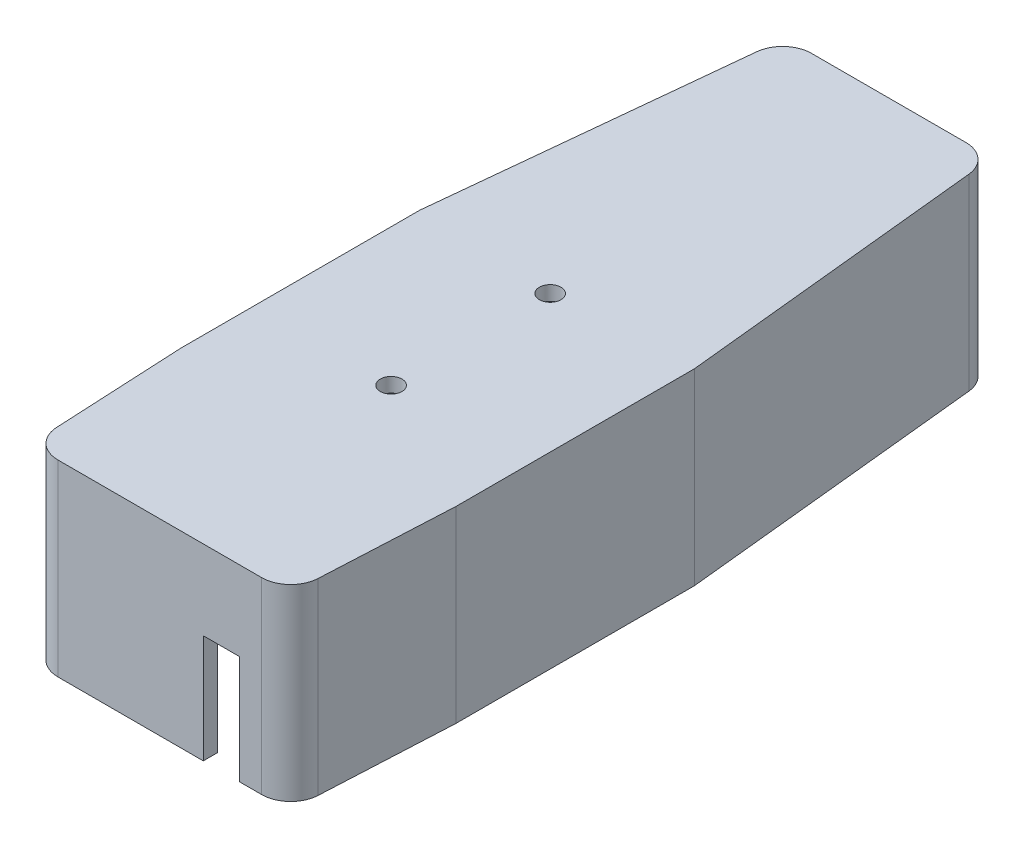
ISO-10303-21;
HEADER;
FILE_DESCRIPTION(('STEP AP214'),'2;1');
FILE_NAME('part.step','',(''),(''),'','','');
FILE_SCHEMA(('AUTOMOTIVE_DESIGN { 1 0 10303 214 1 1 1 1 }'));
ENDSEC;
DATA;
#1=APPLICATION_CONTEXT('core data for automotive mechanical design processes');
#2=APPLICATION_PROTOCOL_DEFINITION('international standard','automotive_design',2000,#1);
#3=PRODUCT_CONTEXT('',#1,'mechanical');
#4=PRODUCT('Part','Part','',(#3));
#5=PRODUCT_RELATED_PRODUCT_CATEGORY('part','',(#4));
#6=PRODUCT_DEFINITION_FORMATION('','',#4);
#7=PRODUCT_DEFINITION_CONTEXT('part definition',#1,'design');
#8=PRODUCT_DEFINITION('design','',#6,#7);
#9=PRODUCT_DEFINITION_SHAPE('','',#8);
#10=(LENGTH_UNIT() NAMED_UNIT(*) SI_UNIT(.MILLI.,.METRE.));
#11=(NAMED_UNIT(*) PLANE_ANGLE_UNIT() SI_UNIT($,.RADIAN.));
#12=(NAMED_UNIT(*) SI_UNIT($,.STERADIAN.) SOLID_ANGLE_UNIT());
#13=UNCERTAINTY_MEASURE_WITH_UNIT(LENGTH_MEASURE(1.E-05),#10,'distance_accuracy_value','');
#14=(GEOMETRIC_REPRESENTATION_CONTEXT(3) GLOBAL_UNCERTAINTY_ASSIGNED_CONTEXT((#13)) GLOBAL_UNIT_ASSIGNED_CONTEXT((#10,
#11,#12)) REPRESENTATION_CONTEXT('',''));
#15=CARTESIAN_POINT('',(0.,0.,0.));
#16=DIRECTION('',(0.,0.,1.));
#17=DIRECTION('',(1.,0.,0.));
#18=AXIS2_PLACEMENT_3D('',#15,#16,#17);
#19=CARTESIAN_POINT('',(6.3058870469266,26.,-74.8480245299378));
#20=DIRECTION('',(0.,-1.,0.));
#21=DIRECTION('',(0.,0.,-1.));
#22=AXIS2_PLACEMENT_3D('',#19,#20,#21);
#23=CYLINDRICAL_SURFACE('',#22,2.);
#24=DIRECTION('',(0.,1.,0.));
#25=VECTOR('',#24,1.);
#26=CARTESIAN_POINT('',(4.31626541224294,26.,-75.0515085607578));
#27=LINE('',#26,#25);
#28=CARTESIAN_POINT('',(4.31626541224294,24.,-75.0515085607578));
#29=VERTEX_POINT('',#28);
#30=CARTESIAN_POINT('',(4.31626541224294,3.,-75.0515085607578));
#31=VERTEX_POINT('',#30);
#32=EDGE_CURVE('E251',#29,#31,#27,.F.);
#33=ORIENTED_EDGE('',*,*,#32,.T.);
#34=CARTESIAN_POINT('',(6.3058870469266,3.,-74.8480245299378));
#35=DIRECTION('',(0.,-1.,0.));
#36=DIRECTION('',(0.,0.,-1.));
#37=AXIS2_PLACEMENT_3D('',#34,#35,#36);
#38=CIRCLE('',#37,2.);
#39=CARTESIAN_POINT('',(6.30588704692662,3.,-76.8480245299378));
#40=VERTEX_POINT('',#39);
#41=EDGE_CURVE('E235',#31,#40,#38,.T.);
#42=ORIENTED_EDGE('',*,*,#41,.T.);
#43=DIRECTION('',(0.,-1.,0.));
#44=VECTOR('',#43,1.);
#45=CARTESIAN_POINT('',(6.30588704692661,26.,-76.8480245299378));
#46=LINE('',#45,#44);
#47=CARTESIAN_POINT('',(6.30588704692661,24.,-76.8480245299378));
#48=VERTEX_POINT('',#47);
#49=EDGE_CURVE('E248',#48,#40,#46,.T.);
#50=ORIENTED_EDGE('',*,*,#49,.F.);
#51=CARTESIAN_POINT('',(6.3058870469266,24.,-74.8480245299378));
#52=DIRECTION('',(0.,-1.,0.));
#53=DIRECTION('',(0.,0.,-1.));
#54=AXIS2_PLACEMENT_3D('',#51,#52,#53);
#55=CIRCLE('',#54,2.);
#56=EDGE_CURVE('E265',#48,#29,#55,.F.);
#57=ORIENTED_EDGE('',*,*,#56,.T.);
#58=EDGE_LOOP('',(#33,#42,#50,#57));
#59=FACE_BOUND('',#58,.T.);
#60=ADVANCED_FACE('F32',(#59),#23,.F.);
#61=CARTESIAN_POINT('',(27.6941129530734,26.,-74.8480245299378));
#62=DIRECTION('',(0.,-1.,0.));
#63=DIRECTION('',(0.,0.,-1.));
#64=AXIS2_PLACEMENT_3D('',#61,#62,#63);
#65=CYLINDRICAL_SURFACE('',#64,2.);
#66=DIRECTION('',(0.,1.,0.));
#67=VECTOR('',#66,1.);
#68=CARTESIAN_POINT('',(27.6941129530734,26.,-76.8480245299378));
#69=LINE('',#68,#67);
#70=CARTESIAN_POINT('',(27.6941129530734,24.,-76.8480245299378));
#71=VERTEX_POINT('',#70);
#72=CARTESIAN_POINT('',(27.6941129530734,3.,-76.8480245299378));
#73=VERTEX_POINT('',#72);
#74=EDGE_CURVE('E257',#71,#73,#69,.F.);
#75=ORIENTED_EDGE('',*,*,#74,.T.);
#76=CARTESIAN_POINT('',(27.6941129530734,3.,-74.8480245299378));
#77=DIRECTION('',(0.,-1.,0.));
#78=DIRECTION('',(0.,0.,-1.));
#79=AXIS2_PLACEMENT_3D('',#76,#77,#78);
#80=CIRCLE('',#79,2.);
#81=CARTESIAN_POINT('',(29.6837345877571,3.,-75.0515085607577));
#82=VERTEX_POINT('',#81);
#83=EDGE_CURVE('E238',#73,#82,#80,.T.);
#84=ORIENTED_EDGE('',*,*,#83,.T.);
#85=DIRECTION('',(0.,-1.,0.));
#86=VECTOR('',#85,1.);
#87=CARTESIAN_POINT('',(29.6837345877571,26.,-75.0515085607577));
#88=LINE('',#87,#86);
#89=CARTESIAN_POINT('',(29.6837345877571,24.,-75.0515085607577));
#90=VERTEX_POINT('',#89);
#91=EDGE_CURVE('E259',#90,#82,#88,.T.);
#92=ORIENTED_EDGE('',*,*,#91,.F.);
#93=CARTESIAN_POINT('',(27.6941129530734,24.,-74.8480245299378));
#94=DIRECTION('',(0.,-1.,0.));
#95=DIRECTION('',(0.,0.,-1.));
#96=AXIS2_PLACEMENT_3D('',#93,#94,#95);
#97=CIRCLE('',#96,2.);
#98=EDGE_CURVE('E261',#90,#71,#97,.F.);
#99=ORIENTED_EDGE('',*,*,#98,.T.);
#100=EDGE_LOOP('',(#75,#84,#92,#99));
#101=FACE_BOUND('',#100,.T.);
#102=ADVANCED_FACE('F530',(#101),#65,.F.);
#103=CARTESIAN_POINT('',(6.30588704692662,26.,-76.8480245299378));
#104=DIRECTION('',(0.,0.,1.));
#105=DIRECTION('',(1.,0.,0.));
#106=AXIS2_PLACEMENT_3D('',#103,#104,#105);
#107=PLANE('',#106);
#108=ORIENTED_EDGE('',*,*,#49,.T.);
#109=DIRECTION('',(1.,0.,0.));
#110=VECTOR('',#109,1.);
#111=CARTESIAN_POINT('',(27.6941129530734,3.,-76.8480245299378));
#112=LINE('',#111,#110);
#113=EDGE_CURVE('E231',#40,#73,#112,.T.);
#114=ORIENTED_EDGE('',*,*,#113,.T.);
#115=ORIENTED_EDGE('',*,*,#74,.F.);
#116=DIRECTION('',(-1.,0.,0.));
#117=VECTOR('',#116,1.);
#118=CARTESIAN_POINT('',(6.3058870469266,24.,-76.8480245299378));
#119=LINE('',#118,#117);
#120=EDGE_CURVE('E256',#71,#48,#119,.T.);
#121=ORIENTED_EDGE('',*,*,#120,.T.);
#122=EDGE_LOOP('',(#108,#114,#115,#121));
#123=FACE_BOUND('',#122,.T.);
#124=ADVANCED_FACE('F254',(#123),#107,.T.);
#125=CARTESIAN_POINT('',(6.3058870469266,0.,-74.8480245299378));
#126=DIRECTION('',(0.,-1.,0.));
#127=DIRECTION('',(0.,0.,-1.));
#128=AXIS2_PLACEMENT_3D('',#125,#126,#127);
#129=PLANE('',#128);
#130=CARTESIAN_POINT('',(9.33617507133186,0.,-71.8480245299378));
#131=DIRECTION('',(0.,-1.,0.));
#132=DIRECTION('',(0.,0.,-1.));
#133=AXIS2_PLACEMENT_3D('',#130,#131,#132);
#134=CIRCLE('',#133,1.397);
#135=CARTESIAN_POINT('',(9.33617507133186,0.,-73.2450245299378));
#136=VERTEX_POINT('',#135);
#137=EDGE_CURVE('E433',#136,#136,#134,.T.);
#138=ORIENTED_EDGE('',*,*,#137,.F.);
#139=EDGE_LOOP('',(#138));
#140=FACE_BOUND('',#139,.T.);
#141=CARTESIAN_POINT('',(24.3355116955853,0.,-71.8480245299378));
#142=DIRECTION('',(0.,-1.,0.));
#143=DIRECTION('',(0.,0.,-1.));
#144=AXIS2_PLACEMENT_3D('',#141,#142,#143);
#145=CIRCLE('',#144,1.397);
#146=CARTESIAN_POINT('',(24.3355116955853,0.,-73.2450245299378));
#147=VERTEX_POINT('',#146);
#148=EDGE_CURVE('E424',#147,#147,#145,.T.);
#149=ORIENTED_EDGE('',*,*,#148,.F.);
#150=EDGE_LOOP('',(#149));
#151=FACE_BOUND('',#150,.T.);
#152=DIRECTION('',(-1.,0.,0.));
#153=VECTOR('',#152,1.);
#154=CARTESIAN_POINT('',(30.5227272727273,0.,-66.8480245299378));
#155=LINE('',#154,#153);
#156=CARTESIAN_POINT('',(30.5227272727273,0.,-66.8480245299378));
#157=VERTEX_POINT('',#156);
#158=CARTESIAN_POINT('',(3.47727272727271,0.,-66.8480245299378));
#159=VERTEX_POINT('',#158);
#160=EDGE_CURVE('E252',#157,#159,#155,.T.);
#161=ORIENTED_EDGE('',*,*,#160,.T.);
#162=DIRECTION('',(-0.101742015409961,0.,0.99481081734183));
#163=VECTOR('',#162,1.);
#164=CARTESIAN_POINT('',(4.31626541224294,0.,-75.0515085607578));
#165=LINE('',#164,#163);
#166=CARTESIAN_POINT('',(0.,0.,-32.8480245299383));
#167=VERTEX_POINT('',#166);
#168=EDGE_CURVE('E57',#159,#167,#165,.T.);
#169=ORIENTED_EDGE('',*,*,#168,.T.);
#170=DIRECTION('',(0.,0.,1.));
#171=VECTOR('',#170,1.);
#172=CARTESIAN_POINT('',(0.,0.,-74.8480245299378));
#173=LINE('',#172,#171);
#174=CARTESIAN_POINT('',(0.,0.,0.));
#175=VERTEX_POINT('',#174);
#176=EDGE_CURVE('E328',#167,#175,#173,.T.);
#177=ORIENTED_EDGE('',*,*,#176,.T.);
#178=DIRECTION('',(0.0499376169438923,0.,0.998752338877845));
#179=VECTOR('',#178,1.);
#180=CARTESIAN_POINT('',(-3.71734315100207,0.,-74.3468630200414));
#181=LINE('',#180,#179);
#182=CARTESIAN_POINT('',(0.904993761694389,0.,18.0998752338878));
#183=VERTEX_POINT('',#182);
#184=EDGE_CURVE('E325',#175,#183,#181,.T.);
#185=ORIENTED_EDGE('',*,*,#184,.T.);
#186=CARTESIAN_POINT('',(2.90249843945008,0.,18.));
#187=DIRECTION('',(0.,-1.,0.));
#188=DIRECTION('',(0.,0.,-1.));
#189=AXIS2_PLACEMENT_3D('',#186,#187,#188);
#190=CIRCLE('',#189,2.);
#191=CARTESIAN_POINT('',(2.90249843945009,0.,20.));
#192=VERTEX_POINT('',#191);
#193=EDGE_CURVE('E322',#183,#192,#190,.F.);
#194=ORIENTED_EDGE('',*,*,#193,.T.);
#195=DIRECTION('',(1.,0.,0.));
#196=VECTOR('',#195,1.);
#197=CARTESIAN_POINT('',(6.30588704692659,0.,20.));
#198=LINE('',#197,#196);
#199=CARTESIAN_POINT('',(23.0088581478139,0.,20.));
#200=VERTEX_POINT('',#199);
#201=EDGE_CURVE('E318',#192,#200,#198,.T.);
#202=ORIENTED_EDGE('',*,*,#201,.T.);
#203=DIRECTION('',(0.,0.,1.));
#204=VECTOR('',#203,1.);
#205=CARTESIAN_POINT('',(23.0088581478139,0.,17.));
#206=LINE('',#205,#204);
#207=CARTESIAN_POINT('',(23.0088581478139,0.,22.));
#208=VERTEX_POINT('',#207);
#209=EDGE_CURVE('E331',#200,#208,#206,.T.);
#210=ORIENTED_EDGE('',*,*,#209,.T.);
#211=DIRECTION('',(1.,0.,0.));
#212=VECTOR('',#211,1.);
#213=CARTESIAN_POINT('',(2.9024984394501,0.,22.));
#214=LINE('',#213,#212);
#215=CARTESIAN_POINT('',(2.9024984394501,0.,22.));
#216=VERTEX_POINT('',#215);
#217=EDGE_CURVE('E371',#216,#208,#214,.T.);
#218=ORIENTED_EDGE('',*,*,#217,.F.);
#219=CARTESIAN_POINT('',(2.90249843945008,0.,18.));
#220=DIRECTION('',(0.,1.,0.));
#221=DIRECTION('',(0.,0.,1.));
#222=AXIS2_PLACEMENT_3D('',#219,#220,#221);
#223=CIRCLE('',#222,4.);
#224=CARTESIAN_POINT('',(-1.0925109160613,0.,18.1997504677755));
#225=VERTEX_POINT('',#224);
#226=EDGE_CURVE('E368',#225,#216,#223,.T.);
#227=ORIENTED_EDGE('',*,*,#226,.F.);
#228=DIRECTION('',(0.0499376169438923,0.,0.998752338877845));
#229=VECTOR('',#228,1.);
#230=CARTESIAN_POINT('',(-2.,0.,0.049968789001573));
#231=LINE('',#230,#229);
#232=CARTESIAN_POINT('',(-2.,0.,0.049968789001573));
#233=VERTEX_POINT('',#232);
#234=EDGE_CURVE('E366',#233,#225,#231,.T.);
#235=ORIENTED_EDGE('',*,*,#234,.F.);
#236=DIRECTION('',(0.,0.,1.));
#237=VECTOR('',#236,1.);
#238=CARTESIAN_POINT('',(-2.,0.,0.049968789001573));
#239=LINE('',#238,#237);
#240=CARTESIAN_POINT('',(-2.,0.,-32.9500312109984));
#241=VERTEX_POINT('',#240);
#242=EDGE_CURVE('E364',#241,#233,#239,.T.);
#243=ORIENTED_EDGE('',*,*,#242,.F.);
#244=DIRECTION('',(-0.101742015409961,0.,0.99481081734183));
#245=VECTOR('',#244,1.);
#246=CARTESIAN_POINT('',(2.32664377755928,0.,-75.2549925915777));
#247=LINE('',#246,#245);
#248=CARTESIAN_POINT('',(2.32664377755928,0.,-75.2549925915777));
#249=VERTEX_POINT('',#248);
#250=EDGE_CURVE('E362',#249,#241,#247,.T.);
#251=ORIENTED_EDGE('',*,*,#250,.F.);
#252=CARTESIAN_POINT('',(6.3058870469266,0.,-74.8480245299378));
#253=DIRECTION('',(0.,1.,0.));
#254=DIRECTION('',(0.,0.,-1.));
#255=AXIS2_PLACEMENT_3D('',#252,#253,#254);
#256=CIRCLE('',#255,4.);
#257=CARTESIAN_POINT('',(6.30588704692662,0.,-78.8480245299378));
#258=VERTEX_POINT('',#257);
#259=EDGE_CURVE('E359',#258,#249,#256,.T.);
#260=ORIENTED_EDGE('',*,*,#259,.F.);
#261=DIRECTION('',(-1.,0.,0.));
#262=VECTOR('',#261,1.);
#263=CARTESIAN_POINT('',(6.30588704692662,0.,-78.8480245299378));
#264=LINE('',#263,#262);
#265=CARTESIAN_POINT('',(27.6941129530734,0.,-78.8480245299378));
#266=VERTEX_POINT('',#265);
#267=EDGE_CURVE('E336',#266,#258,#264,.T.);
#268=ORIENTED_EDGE('',*,*,#267,.F.);
#269=CARTESIAN_POINT('',(27.6941129530734,0.,-74.8480245299378));
#270=DIRECTION('',(0.,1.,0.));
#271=DIRECTION('',(0.,0.,1.));
#272=AXIS2_PLACEMENT_3D('',#269,#270,#271);
#273=CIRCLE('',#272,4.);
#274=CARTESIAN_POINT('',(31.6733562224407,0.,-75.2549925915776));
#275=VERTEX_POINT('',#274);
#276=EDGE_CURVE('E382',#275,#266,#273,.T.);
#277=ORIENTED_EDGE('',*,*,#276,.F.);
#278=DIRECTION('',(-0.10174201540996,0.,-0.99481081734183));
#279=VECTOR('',#278,1.);
#280=CARTESIAN_POINT('',(31.6733562224407,0.,-75.2549925915776));
#281=LINE('',#280,#279);
#282=CARTESIAN_POINT('',(36.,0.,-32.9500312109979));
#283=VERTEX_POINT('',#282);
#284=EDGE_CURVE('E380',#283,#275,#281,.T.);
#285=ORIENTED_EDGE('',*,*,#284,.F.);
#286=DIRECTION('',(0.,0.,-1.));
#287=VECTOR('',#286,1.);
#288=CARTESIAN_POINT('',(36.,0.,0.0499687890020706));
#289=LINE('',#288,#287);
#290=CARTESIAN_POINT('',(36.,0.,0.0499687890020706));
#291=VERTEX_POINT('',#290);
#292=EDGE_CURVE('E378',#291,#283,#289,.T.);
#293=ORIENTED_EDGE('',*,*,#292,.F.);
#294=DIRECTION('',(0.0499376169438955,0.,-0.998752338877845));
#295=VECTOR('',#294,1.);
#296=CARTESIAN_POINT('',(35.0925109160613,0.,18.1997504677747));
#297=LINE('',#296,#295);
#298=CARTESIAN_POINT('',(35.0925109160613,0.,18.1997504677747));
#299=VERTEX_POINT('',#298);
#300=EDGE_CURVE('E376',#299,#291,#297,.T.);
#301=ORIENTED_EDGE('',*,*,#300,.F.);
#302=CARTESIAN_POINT('',(31.0975015605499,0.,18.));
#303=DIRECTION('',(0.,1.,0.));
#304=DIRECTION('',(0.,0.,1.));
#305=AXIS2_PLACEMENT_3D('',#302,#303,#304);
#306=CIRCLE('',#305,4.00000000000001);
#307=CARTESIAN_POINT('',(31.0975015605499,0.,22.));
#308=VERTEX_POINT('',#307);
#309=EDGE_CURVE('E374',#308,#299,#306,.T.);
#310=ORIENTED_EDGE('',*,*,#309,.F.);
#311=CARTESIAN_POINT('',(28.0088581478139,0.,22.));
#312=VERTEX_POINT('',#311);
#313=EDGE_CURVE('E370',#312,#308,#214,.T.);
#314=ORIENTED_EDGE('',*,*,#313,.F.);
#315=DIRECTION('',(0.,0.,1.));
#316=VECTOR('',#315,1.);
#317=CARTESIAN_POINT('',(28.0088581478139,0.,17.));
#318=LINE('',#317,#316);
#319=CARTESIAN_POINT('',(28.0088581478139,0.,20.));
#320=VERTEX_POINT('',#319);
#321=EDGE_CURVE('E468',#320,#312,#318,.T.);
#322=ORIENTED_EDGE('',*,*,#321,.F.);
#323=CARTESIAN_POINT('',(31.0975015605499,0.,20.));
#324=VERTEX_POINT('',#323);
#325=EDGE_CURVE('E321',#320,#324,#198,.T.);
#326=ORIENTED_EDGE('',*,*,#325,.T.);
#327=CARTESIAN_POINT('',(31.0975015605499,0.,18.));
#328=DIRECTION('',(0.,-1.,0.));
#329=DIRECTION('',(0.,0.,-1.));
#330=AXIS2_PLACEMENT_3D('',#327,#328,#329);
#331=CIRCLE('',#330,2.00000000000001);
#332=CARTESIAN_POINT('',(33.0950062383056,0.,18.0998752338874));
#333=VERTEX_POINT('',#332);
#334=EDGE_CURVE('E315',#324,#333,#331,.F.);
#335=ORIENTED_EDGE('',*,*,#334,.T.);
#336=DIRECTION('',(0.0499376169438956,0.,-0.998752338877845));
#337=VECTOR('',#336,1.);
#338=CARTESIAN_POINT('',(37.6640059292912,0.,-73.2801185858195));
#339=LINE('',#338,#337);
#340=CARTESIAN_POINT('',(34.,0.,5.29666642577059E-13));
#341=VERTEX_POINT('',#340);
#342=EDGE_CURVE('E312',#333,#341,#339,.T.);
#343=ORIENTED_EDGE('',*,*,#342,.T.);
#344=DIRECTION('',(0.,0.,-1.));
#345=VECTOR('',#344,1.);
#346=CARTESIAN_POINT('',(34.,0.,-74.8480245299378));
#347=LINE('',#346,#345);
#348=CARTESIAN_POINT('',(34.,0.,-32.8480245299378));
#349=VERTEX_POINT('',#348);
#350=EDGE_CURVE('E309',#341,#349,#347,.T.);
#351=ORIENTED_EDGE('',*,*,#350,.T.);
#352=DIRECTION('',(-0.10174201540996,0.,-0.99481081734183));
#353=VECTOR('',#352,1.);
#354=CARTESIAN_POINT('',(29.4623356997829,0.,-77.2162976876163));
#355=LINE('',#354,#353);
#356=EDGE_CURVE('E306',#349,#157,#355,.T.);
#357=ORIENTED_EDGE('',*,*,#356,.T.);
#358=EDGE_LOOP('',(#161,#169,#177,#185,#194,#202,#210,#218,#227,#235,#243,#251,#260,#268,#277,
#285,#293,#301,#310,#314,#322,#326,#335,#343,#351,#357));
#359=FACE_BOUND('',#358,.T.);
#360=ADVANCED_FACE('F486',(#140,#151,#359),#129,.T.);
#361=CARTESIAN_POINT('',(6.3058870469266,26.,-74.8480245299378));
#362=DIRECTION('',(0.,-1.,0.));
#363=DIRECTION('',(0.,0.,-1.));
#364=AXIS2_PLACEMENT_3D('',#361,#362,#363);
#365=CYLINDRICAL_SURFACE('',#364,4.);
#366=ORIENTED_EDGE('',*,*,#259,.T.);
#367=DIRECTION('',(0.,-1.,0.));
#368=VECTOR('',#367,1.);
#369=CARTESIAN_POINT('',(2.32664377755928,26.,-75.2549925915777));
#370=LINE('',#369,#368);
#371=CARTESIAN_POINT('',(2.32664377755928,26.,-75.2549925915777));
#372=VERTEX_POINT('',#371);
#373=EDGE_CURVE('E417',#372,#249,#370,.T.);
#374=ORIENTED_EDGE('',*,*,#373,.F.);
#375=CARTESIAN_POINT('',(6.3058870469266,26.,-74.8480245299378));
#376=DIRECTION('',(0.,1.,0.));
#377=DIRECTION('',(0.,0.,-1.));
#378=AXIS2_PLACEMENT_3D('',#375,#376,#377);
#379=CIRCLE('',#378,4.);
#380=CARTESIAN_POINT('',(6.30588704692662,26.,-78.8480245299378));
#381=VERTEX_POINT('',#380);
#382=EDGE_CURVE('E332',#381,#372,#379,.T.);
#383=ORIENTED_EDGE('',*,*,#382,.F.);
#384=DIRECTION('',(0.,-1.,0.));
#385=VECTOR('',#384,1.);
#386=CARTESIAN_POINT('',(6.30588704692662,26.,-78.8480245299378));
#387=LINE('',#386,#385);
#388=EDGE_CURVE('E358',#381,#258,#387,.T.);
#389=ORIENTED_EDGE('',*,*,#388,.T.);
#390=EDGE_LOOP('',(#366,#374,#383,#389));
#391=FACE_BOUND('',#390,.T.);
#392=ADVANCED_FACE('F34',(#391),#365,.T.);
#393=CARTESIAN_POINT('',(2.32664377755928,26.,-75.2549925915777));
#394=DIRECTION('',(0.99481081734183,0.,0.101742015409961));
#395=DIRECTION('',(0.101742015409961,0.,-0.99481081734183));
#396=AXIS2_PLACEMENT_3D('',#393,#394,#395);
#397=PLANE('',#396);
#398=ORIENTED_EDGE('',*,*,#250,.T.);
#399=DIRECTION('',(0.,-1.,0.));
#400=VECTOR('',#399,1.);
#401=CARTESIAN_POINT('',(-2.,26.,-32.9500312109984));
#402=LINE('',#401,#400);
#403=CARTESIAN_POINT('',(-2.,26.,-32.9500312109984));
#404=VERTEX_POINT('',#403);
#405=EDGE_CURVE('E414',#404,#241,#402,.T.);
#406=ORIENTED_EDGE('',*,*,#405,.F.);
#407=DIRECTION('',(-0.101742015409961,0.,0.99481081734183));
#408=VECTOR('',#407,1.);
#409=CARTESIAN_POINT('',(2.32664377755928,26.,-75.2549925915777));
#410=LINE('',#409,#408);
#411=EDGE_CURVE('E335',#372,#404,#410,.T.);
#412=ORIENTED_EDGE('',*,*,#411,.F.);
#413=ORIENTED_EDGE('',*,*,#373,.T.);
#414=EDGE_LOOP('',(#398,#406,#412,#413));
#415=FACE_BOUND('',#414,.T.);
#416=ADVANCED_FACE('F614',(#415),#397,.F.);
#417=CARTESIAN_POINT('',(-2.,26.,0.049968789001573));
#418=DIRECTION('',(1.,0.,0.));
#419=DIRECTION('',(0.,0.,-1.));
#420=AXIS2_PLACEMENT_3D('',#417,#418,#419);
#421=PLANE('',#420);
#422=ORIENTED_EDGE('',*,*,#242,.T.);
#423=DIRECTION('',(0.,-1.,0.));
#424=VECTOR('',#423,1.);
#425=CARTESIAN_POINT('',(-2.,26.,0.049968789001573));
#426=LINE('',#425,#424);
#427=CARTESIAN_POINT('',(-2.,26.,0.049968789001573));
#428=VERTEX_POINT('',#427);
#429=EDGE_CURVE('E411',#428,#233,#426,.T.);
#430=ORIENTED_EDGE('',*,*,#429,.F.);
#431=DIRECTION('',(0.,0.,1.));
#432=VECTOR('',#431,1.);
#433=CARTESIAN_POINT('',(-2.,26.,0.049968789001573));
#434=LINE('',#433,#432);
#435=EDGE_CURVE('E338',#404,#428,#434,.T.);
#436=ORIENTED_EDGE('',*,*,#435,.F.);
#437=ORIENTED_EDGE('',*,*,#405,.T.);
#438=EDGE_LOOP('',(#422,#430,#436,#437));
#439=FACE_BOUND('',#438,.T.);
#440=ADVANCED_FACE('F611',(#439),#421,.F.);
#441=CARTESIAN_POINT('',(-2.,26.,0.049968789001573));
#442=DIRECTION('',(0.998752338877845,0.,-0.0499376169438923));
#443=DIRECTION('',(-0.0499376169438923,0.,-0.998752338877845));
#444=AXIS2_PLACEMENT_3D('',#441,#442,#443);
#445=PLANE('',#444);
#446=ORIENTED_EDGE('',*,*,#234,.T.);
#447=DIRECTION('',(0.,-1.,0.));
#448=VECTOR('',#447,1.);
#449=CARTESIAN_POINT('',(-1.0925109160613,26.,18.1997504677755));
#450=LINE('',#449,#448);
#451=CARTESIAN_POINT('',(-1.0925109160613,26.,18.1997504677755));
#452=VERTEX_POINT('',#451);
#453=EDGE_CURVE('E408',#452,#225,#450,.T.);
#454=ORIENTED_EDGE('',*,*,#453,.F.);
#455=DIRECTION('',(0.0499376169438923,0.,0.998752338877845));
#456=VECTOR('',#455,1.);
#457=CARTESIAN_POINT('',(-2.,26.,0.049968789001573));
#458=LINE('',#457,#456);
#459=EDGE_CURVE('E340',#428,#452,#458,.T.);
#460=ORIENTED_EDGE('',*,*,#459,.F.);
#461=ORIENTED_EDGE('',*,*,#429,.T.);
#462=EDGE_LOOP('',(#446,#454,#460,#461));
#463=FACE_BOUND('',#462,.T.);
#464=ADVANCED_FACE('F608',(#463),#445,.F.);
#465=CARTESIAN_POINT('',(2.90249843945008,26.,18.));
#466=DIRECTION('',(0.,-1.,0.));
#467=DIRECTION('',(0.,0.,-1.));
#468=AXIS2_PLACEMENT_3D('',#465,#466,#467);
#469=CYLINDRICAL_SURFACE('',#468,4.);
#470=ORIENTED_EDGE('',*,*,#226,.T.);
#471=DIRECTION('',(0.,-1.,0.));
#472=VECTOR('',#471,1.);
#473=CARTESIAN_POINT('',(2.9024984394501,26.,22.));
#474=LINE('',#473,#472);
#475=CARTESIAN_POINT('',(2.9024984394501,26.,22.));
#476=VERTEX_POINT('',#475);
#477=EDGE_CURVE('E405',#476,#216,#474,.T.);
#478=ORIENTED_EDGE('',*,*,#477,.F.);
#479=CARTESIAN_POINT('',(2.90249843945008,26.,18.));
#480=DIRECTION('',(0.,1.,0.));
#481=DIRECTION('',(0.,0.,1.));
#482=AXIS2_PLACEMENT_3D('',#479,#480,#481);
#483=CIRCLE('',#482,4.);
#484=EDGE_CURVE('E342',#452,#476,#483,.T.);
#485=ORIENTED_EDGE('',*,*,#484,.F.);
#486=ORIENTED_EDGE('',*,*,#453,.T.);
#487=EDGE_LOOP('',(#470,#478,#485,#486));
#488=FACE_BOUND('',#487,.T.);
#489=ADVANCED_FACE('F605',(#488),#469,.T.);
#490=CARTESIAN_POINT('',(2.9024984394501,26.,22.));
#491=DIRECTION('',(0.,0.,-1.));
#492=DIRECTION('',(-1.,0.,0.));
#493=AXIS2_PLACEMENT_3D('',#490,#491,#492);
#494=PLANE('',#493);
#495=ORIENTED_EDGE('',*,*,#217,.T.);
#496=DIRECTION('',(0.,-1.,0.));
#497=VECTOR('',#496,1.);
#498=CARTESIAN_POINT('',(23.0088581478139,0.,22.));
#499=LINE('',#498,#497);
#500=CARTESIAN_POINT('',(23.0088581478139,15.,22.));
#501=VERTEX_POINT('',#500);
#502=EDGE_CURVE('E466',#501,#208,#499,.T.);
#503=ORIENTED_EDGE('',*,*,#502,.F.);
#504=DIRECTION('',(-1.,0.,0.));
#505=VECTOR('',#504,1.);
#506=CARTESIAN_POINT('',(28.0088581478139,15.,22.));
#507=LINE('',#506,#505);
#508=CARTESIAN_POINT('',(28.0088581478139,15.,22.));
#509=VERTEX_POINT('',#508);
#510=EDGE_CURVE('E463',#509,#501,#507,.T.);
#511=ORIENTED_EDGE('',*,*,#510,.F.);
#512=DIRECTION('',(0.,1.,0.));
#513=VECTOR('',#512,1.);
#514=CARTESIAN_POINT('',(28.0088581478139,0.,22.));
#515=LINE('',#514,#513);
#516=EDGE_CURVE('E461',#312,#509,#515,.T.);
#517=ORIENTED_EDGE('',*,*,#516,.F.);
#518=ORIENTED_EDGE('',*,*,#313,.T.);
#519=DIRECTION('',(0.,-1.,0.));
#520=VECTOR('',#519,1.);
#521=CARTESIAN_POINT('',(31.0975015605499,26.,22.));
#522=LINE('',#521,#520);
#523=CARTESIAN_POINT('',(31.0975015605499,26.,22.));
#524=VERTEX_POINT('',#523);
#525=EDGE_CURVE('E402',#524,#308,#522,.T.);
#526=ORIENTED_EDGE('',*,*,#525,.F.);
#527=DIRECTION('',(1.,0.,0.));
#528=VECTOR('',#527,1.);
#529=CARTESIAN_POINT('',(2.9024984394501,26.,22.));
#530=LINE('',#529,#528);
#531=EDGE_CURVE('E344',#476,#524,#530,.T.);
#532=ORIENTED_EDGE('',*,*,#531,.F.);
#533=ORIENTED_EDGE('',*,*,#477,.T.);
#534=EDGE_LOOP('',(#495,#503,#511,#517,#518,#526,#532,#533));
#535=FACE_BOUND('',#534,.T.);
#536=ADVANCED_FACE('F482',(#535),#494,.F.);
#537=CARTESIAN_POINT('',(31.0975015605499,26.,18.));
#538=DIRECTION('',(0.,-1.,0.));
#539=DIRECTION('',(0.,0.,-1.));
#540=AXIS2_PLACEMENT_3D('',#537,#538,#539);
#541=CYLINDRICAL_SURFACE('',#540,4.00000000000001);
#542=ORIENTED_EDGE('',*,*,#309,.T.);
#543=DIRECTION('',(0.,-1.,0.));
#544=VECTOR('',#543,1.);
#545=CARTESIAN_POINT('',(35.0925109160613,26.,18.1997504677747));
#546=LINE('',#545,#544);
#547=CARTESIAN_POINT('',(35.0925109160613,26.,18.1997504677747));
#548=VERTEX_POINT('',#547);
#549=EDGE_CURVE('E399',#548,#299,#546,.T.);
#550=ORIENTED_EDGE('',*,*,#549,.F.);
#551=CARTESIAN_POINT('',(31.0975015605499,26.,18.));
#552=DIRECTION('',(0.,1.,0.));
#553=DIRECTION('',(0.,0.,1.));
#554=AXIS2_PLACEMENT_3D('',#551,#552,#553);
#555=CIRCLE('',#554,4.00000000000001);
#556=EDGE_CURVE('E346',#524,#548,#555,.T.);
#557=ORIENTED_EDGE('',*,*,#556,.F.);
#558=ORIENTED_EDGE('',*,*,#525,.T.);
#559=EDGE_LOOP('',(#542,#550,#557,#558));
#560=FACE_BOUND('',#559,.T.);
#561=ADVANCED_FACE('F491',(#560),#541,.T.);
#562=CARTESIAN_POINT('',(35.0925109160613,26.,18.1997504677747));
#563=DIRECTION('',(-0.998752338877844,0.,-0.0499376169438955));
#564=DIRECTION('',(-0.0499376169438956,0.,0.998752338877845));
#565=AXIS2_PLACEMENT_3D('',#562,#563,#564);
#566=PLANE('',#565);
#567=ORIENTED_EDGE('',*,*,#300,.T.);
#568=DIRECTION('',(0.,-1.,0.));
#569=VECTOR('',#568,1.);
#570=CARTESIAN_POINT('',(36.,26.,0.0499687890020706));
#571=LINE('',#570,#569);
#572=CARTESIAN_POINT('',(36.,26.,0.0499687890020706));
#573=VERTEX_POINT('',#572);
#574=EDGE_CURVE('E396',#573,#291,#571,.T.);
#575=ORIENTED_EDGE('',*,*,#574,.F.);
#576=DIRECTION('',(0.0499376169438955,0.,-0.998752338877845));
#577=VECTOR('',#576,1.);
#578=CARTESIAN_POINT('',(35.0925109160613,26.,18.1997504677747));
#579=LINE('',#578,#577);
#580=EDGE_CURVE('E348',#548,#573,#579,.T.);
#581=ORIENTED_EDGE('',*,*,#580,.F.);
#582=ORIENTED_EDGE('',*,*,#549,.T.);
#583=EDGE_LOOP('',(#567,#575,#581,#582));
#584=FACE_BOUND('',#583,.T.);
#585=ADVANCED_FACE('F495',(#584),#566,.F.);
#586=CARTESIAN_POINT('',(36.,26.,0.0499687890020706));
#587=DIRECTION('',(-1.,0.,0.));
#588=DIRECTION('',(0.,0.,1.));
#589=AXIS2_PLACEMENT_3D('',#586,#587,#588);
#590=PLANE('',#589);
#591=ORIENTED_EDGE('',*,*,#292,.T.);
#592=DIRECTION('',(0.,-1.,0.));
#593=VECTOR('',#592,1.);
#594=CARTESIAN_POINT('',(36.,26.,-32.9500312109979));
#595=LINE('',#594,#593);
#596=CARTESIAN_POINT('',(36.,26.,-32.9500312109979));
#597=VERTEX_POINT('',#596);
#598=EDGE_CURVE('E393',#597,#283,#595,.T.);
#599=ORIENTED_EDGE('',*,*,#598,.F.);
#600=DIRECTION('',(0.,0.,-1.));
#601=VECTOR('',#600,1.);
#602=CARTESIAN_POINT('',(36.,26.,0.0499687890020706));
#603=LINE('',#602,#601);
#604=EDGE_CURVE('E350',#573,#597,#603,.T.);
#605=ORIENTED_EDGE('',*,*,#604,.F.);
#606=ORIENTED_EDGE('',*,*,#574,.T.);
#607=EDGE_LOOP('',(#591,#599,#605,#606));
#608=FACE_BOUND('',#607,.T.);
#609=ADVANCED_FACE('F594',(#608),#590,.F.);
#610=CARTESIAN_POINT('',(31.6733562224407,26.,-75.2549925915776));
#611=DIRECTION('',(-0.99481081734183,0.,0.10174201540996));
#612=DIRECTION('',(0.10174201540996,0.,0.99481081734183));
#613=AXIS2_PLACEMENT_3D('',#610,#611,#612);
#614=PLANE('',#613);
#615=ORIENTED_EDGE('',*,*,#284,.T.);
#616=DIRECTION('',(0.,-1.,0.));
#617=VECTOR('',#616,1.);
#618=CARTESIAN_POINT('',(31.6733562224407,26.,-75.2549925915776));
#619=LINE('',#618,#617);
#620=CARTESIAN_POINT('',(31.6733562224407,26.,-75.2549925915776));
#621=VERTEX_POINT('',#620);
#622=EDGE_CURVE('E390',#621,#275,#619,.T.);
#623=ORIENTED_EDGE('',*,*,#622,.F.);
#624=DIRECTION('',(-0.10174201540996,0.,-0.99481081734183));
#625=VECTOR('',#624,1.);
#626=CARTESIAN_POINT('',(31.6733562224407,26.,-75.2549925915776));
#627=LINE('',#626,#625);
#628=EDGE_CURVE('E352',#597,#621,#627,.T.);
#629=ORIENTED_EDGE('',*,*,#628,.F.);
#630=ORIENTED_EDGE('',*,*,#598,.T.);
#631=EDGE_LOOP('',(#615,#623,#629,#630));
#632=FACE_BOUND('',#631,.T.);
#633=ADVANCED_FACE('F590',(#632),#614,.F.);
#634=CARTESIAN_POINT('',(27.6941129530734,26.,-74.8480245299378));
#635=DIRECTION('',(0.,-1.,0.));
#636=DIRECTION('',(0.,0.,-1.));
#637=AXIS2_PLACEMENT_3D('',#634,#635,#636);
#638=CYLINDRICAL_SURFACE('',#637,4.);
#639=ORIENTED_EDGE('',*,*,#276,.T.);
#640=DIRECTION('',(0.,-1.,0.));
#641=VECTOR('',#640,1.);
#642=CARTESIAN_POINT('',(27.6941129530734,26.,-78.8480245299378));
#643=LINE('',#642,#641);
#644=CARTESIAN_POINT('',(27.6941129530734,26.,-78.8480245299378));
#645=VERTEX_POINT('',#644);
#646=EDGE_CURVE('E387',#645,#266,#643,.T.);
#647=ORIENTED_EDGE('',*,*,#646,.F.);
#648=CARTESIAN_POINT('',(27.6941129530734,26.,-74.8480245299378));
#649=DIRECTION('',(0.,1.,0.));
#650=DIRECTION('',(0.,0.,1.));
#651=AXIS2_PLACEMENT_3D('',#648,#649,#650);
#652=CIRCLE('',#651,4.);
#653=EDGE_CURVE('E354',#621,#645,#652,.T.);
#654=ORIENTED_EDGE('',*,*,#653,.F.);
#655=ORIENTED_EDGE('',*,*,#622,.T.);
#656=EDGE_LOOP('',(#639,#647,#654,#655));
#657=FACE_BOUND('',#656,.T.);
#658=ADVANCED_FACE('F586',(#657),#638,.T.);
#659=CARTESIAN_POINT('',(6.30588704692662,26.,-78.8480245299378));
#660=DIRECTION('',(0.,0.,1.));
#661=DIRECTION('',(1.,0.,0.));
#662=AXIS2_PLACEMENT_3D('',#659,#660,#661);
#663=PLANE('',#662);
#664=ORIENTED_EDGE('',*,*,#267,.T.);
#665=ORIENTED_EDGE('',*,*,#388,.F.);
#666=DIRECTION('',(-1.,0.,0.));
#667=VECTOR('',#666,1.);
#668=CARTESIAN_POINT('',(6.30588704692662,26.,-78.8480245299378));
#669=LINE('',#668,#667);
#670=EDGE_CURVE('E356',#645,#381,#669,.T.);
#671=ORIENTED_EDGE('',*,*,#670,.F.);
#672=ORIENTED_EDGE('',*,*,#646,.T.);
#673=EDGE_LOOP('',(#664,#665,#671,#672));
#674=FACE_BOUND('',#673,.T.);
#675=ADVANCED_FACE('F579',(#674),#663,.F.);
#676=CARTESIAN_POINT('',(6.3058870469266,26.,-74.8480245299378));
#677=DIRECTION('',(0.,-1.,0.));
#678=DIRECTION('',(0.,0.,-1.));
#679=AXIS2_PLACEMENT_3D('',#676,#677,#678);
#680=PLANE('',#679);
#681=CARTESIAN_POINT('',(17.,26.,-32.));
#682=DIRECTION('',(0.,-1.,0.));
#683=DIRECTION('',(0.,0.,-1.));
#684=AXIS2_PLACEMENT_3D('',#681,#682,#683);
#685=CIRCLE('',#684,1.5);
#686=CARTESIAN_POINT('',(17.,26.,-33.5));
#687=VERTEX_POINT('',#686);
#688=EDGE_CURVE('E452',#687,#687,#685,.T.);
#689=ORIENTED_EDGE('',*,*,#688,.T.);
#690=EDGE_LOOP('',(#689));
#691=FACE_BOUND('',#690,.T.);
#692=CARTESIAN_POINT('',(17.,26.,-10.));
#693=DIRECTION('',(0.,-1.,0.));
#694=DIRECTION('',(0.,0.,-1.));
#695=AXIS2_PLACEMENT_3D('',#692,#693,#694);
#696=CIRCLE('',#695,1.5);
#697=CARTESIAN_POINT('',(17.,26.,-11.5));
#698=VERTEX_POINT('',#697);
#699=EDGE_CURVE('E458',#698,#698,#696,.T.);
#700=ORIENTED_EDGE('',*,*,#699,.T.);
#701=EDGE_LOOP('',(#700));
#702=FACE_BOUND('',#701,.T.);
#703=ORIENTED_EDGE('',*,*,#382,.T.);
#704=ORIENTED_EDGE('',*,*,#411,.T.);
#705=ORIENTED_EDGE('',*,*,#435,.T.);
#706=ORIENTED_EDGE('',*,*,#459,.T.);
#707=ORIENTED_EDGE('',*,*,#484,.T.);
#708=ORIENTED_EDGE('',*,*,#531,.T.);
#709=ORIENTED_EDGE('',*,*,#556,.T.);
#710=ORIENTED_EDGE('',*,*,#580,.T.);
#711=ORIENTED_EDGE('',*,*,#604,.T.);
#712=ORIENTED_EDGE('',*,*,#628,.T.);
#713=ORIENTED_EDGE('',*,*,#653,.T.);
#714=ORIENTED_EDGE('',*,*,#670,.T.);
#715=EDGE_LOOP('',(#703,#704,#705,#706,#707,#708,#709,#710,#711,#712,#713,#714));
#716=FACE_BOUND('',#715,.T.);
#717=ADVANCED_FACE('F499',(#691,#702,#716),#680,.F.);
#718=CARTESIAN_POINT('',(4.31626541224294,26.,-75.0515085607578));
#719=DIRECTION('',(0.99481081734183,0.,0.101742015409961));
#720=DIRECTION('',(0.101742015409961,0.,-0.99481081734183));
#721=AXIS2_PLACEMENT_3D('',#718,#719,#720);
#722=PLANE('',#721);
#723=DIRECTION('',(0.,-1.,0.));
#724=VECTOR('',#723,1.);
#725=CARTESIAN_POINT('',(3.47727272727271,3.,-66.8480245299378));
#726=LINE('',#725,#724);
#727=CARTESIAN_POINT('',(3.47727272727271,3.,-66.8480245299378));
#728=VERTEX_POINT('',#727);
#729=EDGE_CURVE('E445',#728,#159,#726,.T.);
#730=ORIENTED_EDGE('',*,*,#729,.F.);
#731=DIRECTION('',(0.101742015409961,0.,-0.99481081734183));
#732=VECTOR('',#731,1.);
#733=CARTESIAN_POINT('',(4.31626541224294,3.,-75.0515085607578));
#734=LINE('',#733,#732);
#735=EDGE_CURVE('E442',#728,#31,#734,.T.);
#736=ORIENTED_EDGE('',*,*,#735,.T.);
#737=ORIENTED_EDGE('',*,*,#32,.F.);
#738=DIRECTION('',(-0.101742015409961,0.,0.99481081734183));
#739=VECTOR('',#738,1.);
#740=CARTESIAN_POINT('',(4.31626541224294,24.,-75.0515085607578));
#741=LINE('',#740,#739);
#742=CARTESIAN_POINT('',(0.,24.,-32.8480245299383));
#743=VERTEX_POINT('',#742);
#744=EDGE_CURVE('E271',#29,#743,#741,.T.);
#745=ORIENTED_EDGE('',*,*,#744,.T.);
#746=DIRECTION('',(0.,-1.,0.));
#747=VECTOR('',#746,1.);
#748=CARTESIAN_POINT('',(0.,26.,-32.8480245299383));
#749=LINE('',#748,#747);
#750=EDGE_CURVE('E267',#743,#167,#749,.T.);
#751=ORIENTED_EDGE('',*,*,#750,.T.);
#752=ORIENTED_EDGE('',*,*,#168,.F.);
#753=EDGE_LOOP('',(#730,#736,#737,#745,#751,#752));
#754=FACE_BOUND('',#753,.T.);
#755=ADVANCED_FACE('F538',(#754),#722,.T.);
#756=CARTESIAN_POINT('',(0.,26.,0.049968789001573));
#757=DIRECTION('',(1.,0.,0.));
#758=DIRECTION('',(0.,0.,-1.));
#759=AXIS2_PLACEMENT_3D('',#756,#757,#758);
#760=PLANE('',#759);
#761=ORIENTED_EDGE('',*,*,#176,.F.);
#762=ORIENTED_EDGE('',*,*,#750,.F.);
#763=DIRECTION('',(0.,0.,1.));
#764=VECTOR('',#763,1.);
#765=CARTESIAN_POINT('',(0.,24.,-74.8480245299378));
#766=LINE('',#765,#764);
#767=CARTESIAN_POINT('',(0.,24.,0.));
#768=VERTEX_POINT('',#767);
#769=EDGE_CURVE('E273',#743,#768,#766,.T.);
#770=ORIENTED_EDGE('',*,*,#769,.T.);
#771=DIRECTION('',(0.,-1.,0.));
#772=VECTOR('',#771,1.);
#773=CARTESIAN_POINT('',(0.,26.,0.));
#774=LINE('',#773,#772);
#775=EDGE_CURVE('E270',#768,#175,#774,.T.);
#776=ORIENTED_EDGE('',*,*,#775,.T.);
#777=EDGE_LOOP('',(#761,#762,#770,#776));
#778=FACE_BOUND('',#777,.T.);
#779=ADVANCED_FACE('F541',(#778),#760,.T.);
#780=CARTESIAN_POINT('',(-0.00249532224431059,26.,-0.0499064448862116));
#781=DIRECTION('',(0.998752338877845,0.,-0.0499376169438923));
#782=DIRECTION('',(-0.0499376169438923,0.,-0.998752338877845));
#783=AXIS2_PLACEMENT_3D('',#780,#781,#782);
#784=PLANE('',#783);
#785=ORIENTED_EDGE('',*,*,#184,.F.);
#786=ORIENTED_EDGE('',*,*,#775,.F.);
#787=DIRECTION('',(0.0499376169438923,0.,0.998752338877845));
#788=VECTOR('',#787,1.);
#789=CARTESIAN_POINT('',(-3.71734315100207,24.,-74.3468630200414));
#790=LINE('',#789,#788);
#791=CARTESIAN_POINT('',(0.90499376169439,24.,18.0998752338878));
#792=VERTEX_POINT('',#791);
#793=EDGE_CURVE('E277',#768,#792,#790,.T.);
#794=ORIENTED_EDGE('',*,*,#793,.T.);
#795=DIRECTION('',(0.,-1.,0.));
#796=VECTOR('',#795,1.);
#797=CARTESIAN_POINT('',(0.90499376169439,26.,18.0998752338878));
#798=LINE('',#797,#796);
#799=EDGE_CURVE('E275',#792,#183,#798,.T.);
#800=ORIENTED_EDGE('',*,*,#799,.T.);
#801=EDGE_LOOP('',(#785,#786,#794,#800));
#802=FACE_BOUND('',#801,.T.);
#803=ADVANCED_FACE('F545',(#802),#784,.T.);
#804=CARTESIAN_POINT('',(2.90249843945008,26.,18.));
#805=DIRECTION('',(0.,-1.,0.));
#806=DIRECTION('',(0.,0.,-1.));
#807=AXIS2_PLACEMENT_3D('',#804,#805,#806);
#808=CYLINDRICAL_SURFACE('',#807,2.);
#809=ORIENTED_EDGE('',*,*,#193,.F.);
#810=ORIENTED_EDGE('',*,*,#799,.F.);
#811=CARTESIAN_POINT('',(2.90249843945008,24.,18.));
#812=DIRECTION('',(0.,-1.,0.));
#813=DIRECTION('',(0.,0.,-1.));
#814=AXIS2_PLACEMENT_3D('',#811,#812,#813);
#815=CIRCLE('',#814,2.);
#816=CARTESIAN_POINT('',(2.9024984394501,24.,20.));
#817=VERTEX_POINT('',#816);
#818=EDGE_CURVE('E281',#792,#817,#815,.F.);
#819=ORIENTED_EDGE('',*,*,#818,.T.);
#820=DIRECTION('',(0.,1.,0.));
#821=VECTOR('',#820,1.);
#822=CARTESIAN_POINT('',(2.9024984394501,26.,20.));
#823=LINE('',#822,#821);
#824=EDGE_CURVE('E279',#817,#192,#823,.F.);
#825=ORIENTED_EDGE('',*,*,#824,.T.);
#826=EDGE_LOOP('',(#809,#810,#819,#825));
#827=FACE_BOUND('',#826,.T.);
#828=ADVANCED_FACE('F549',(#827),#808,.F.);
#829=CARTESIAN_POINT('',(2.9024984394501,26.,20.));
#830=DIRECTION('',(0.,0.,-1.));
#831=DIRECTION('',(-1.,0.,0.));
#832=AXIS2_PLACEMENT_3D('',#829,#830,#831);
#833=PLANE('',#832);
#834=DIRECTION('',(0.,1.,0.));
#835=VECTOR('',#834,1.);
#836=CARTESIAN_POINT('',(23.0088581478139,26.,20.));
#837=LINE('',#836,#835);
#838=CARTESIAN_POINT('',(23.0088581478139,15.,20.));
#839=VERTEX_POINT('',#838);
#840=EDGE_CURVE('E11',#200,#839,#837,.T.);
#841=ORIENTED_EDGE('',*,*,#840,.F.);
#842=ORIENTED_EDGE('',*,*,#201,.F.);
#843=ORIENTED_EDGE('',*,*,#824,.F.);
#844=DIRECTION('',(1.,0.,0.));
#845=VECTOR('',#844,1.);
#846=CARTESIAN_POINT('',(6.30588704692659,24.,20.));
#847=LINE('',#846,#845);
#848=CARTESIAN_POINT('',(31.0975015605499,24.,20.));
#849=VERTEX_POINT('',#848);
#850=EDGE_CURVE('E285',#817,#849,#847,.T.);
#851=ORIENTED_EDGE('',*,*,#850,.T.);
#852=DIRECTION('',(0.,-1.,0.));
#853=VECTOR('',#852,1.);
#854=CARTESIAN_POINT('',(31.0975015605499,26.,20.));
#855=LINE('',#854,#853);
#856=EDGE_CURVE('E283',#849,#324,#855,.T.);
#857=ORIENTED_EDGE('',*,*,#856,.T.);
#858=ORIENTED_EDGE('',*,*,#325,.F.);
#859=DIRECTION('',(0.,-1.,0.));
#860=VECTOR('',#859,1.);
#861=CARTESIAN_POINT('',(28.0088581478139,26.,20.));
#862=LINE('',#861,#860);
#863=CARTESIAN_POINT('',(28.0088581478139,15.,20.));
#864=VERTEX_POINT('',#863);
#865=EDGE_CURVE('E420',#864,#320,#862,.T.);
#866=ORIENTED_EDGE('',*,*,#865,.F.);
#867=DIRECTION('',(1.,0.,0.));
#868=VECTOR('',#867,1.);
#869=CARTESIAN_POINT('',(2.9024984394501,15.,20.));
#870=LINE('',#869,#868);
#871=EDGE_CURVE('E41',#839,#864,#870,.T.);
#872=ORIENTED_EDGE('',*,*,#871,.F.);
#873=EDGE_LOOP('',(#841,#842,#843,#851,#857,#858,#866,#872));
#874=FACE_BOUND('',#873,.T.);
#875=ADVANCED_FACE('F515',(#874),#833,.T.);
#876=CARTESIAN_POINT('',(31.0975015605499,26.,18.));
#877=DIRECTION('',(0.,-1.,0.));
#878=DIRECTION('',(0.,0.,-1.));
#879=AXIS2_PLACEMENT_3D('',#876,#877,#878);
#880=CYLINDRICAL_SURFACE('',#879,2.00000000000001);
#881=ORIENTED_EDGE('',*,*,#334,.F.);
#882=ORIENTED_EDGE('',*,*,#856,.F.);
#883=CARTESIAN_POINT('',(31.0975015605499,24.,18.));
#884=DIRECTION('',(0.,-1.,0.));
#885=DIRECTION('',(0.,0.,-1.));
#886=AXIS2_PLACEMENT_3D('',#883,#884,#885);
#887=CIRCLE('',#886,2.00000000000001);
#888=CARTESIAN_POINT('',(33.0950062383056,24.,18.0998752338869));
#889=VERTEX_POINT('',#888);
#890=EDGE_CURVE('E290',#849,#889,#887,.F.);
#891=ORIENTED_EDGE('',*,*,#890,.T.);
#892=DIRECTION('',(0.,1.,0.));
#893=VECTOR('',#892,1.);
#894=CARTESIAN_POINT('',(33.0950062383056,26.,18.0998752338869));
#895=LINE('',#894,#893);
#896=EDGE_CURVE('E288',#889,#333,#895,.F.);
#897=ORIENTED_EDGE('',*,*,#896,.T.);
#898=EDGE_LOOP('',(#881,#882,#891,#897));
#899=FACE_BOUND('',#898,.T.);
#900=ADVANCED_FACE('F556',(#899),#880,.F.);
#901=CARTESIAN_POINT('',(33.0950062383056,26.,18.0998752338869));
#902=DIRECTION('',(-0.998752338877844,0.,-0.0499376169438955));
#903=DIRECTION('',(-0.0499376169438956,0.,0.998752338877845));
#904=AXIS2_PLACEMENT_3D('',#901,#902,#903);
#905=PLANE('',#904);
#906=ORIENTED_EDGE('',*,*,#342,.F.);
#907=ORIENTED_EDGE('',*,*,#896,.F.);
#908=DIRECTION('',(0.0499376169438956,0.,-0.998752338877845));
#909=VECTOR('',#908,1.);
#910=CARTESIAN_POINT('',(37.6640059292912,24.,-73.2801185858195));
#911=LINE('',#910,#909);
#912=CARTESIAN_POINT('',(34.,24.,5.29666642577059E-13));
#913=VERTEX_POINT('',#912);
#914=EDGE_CURVE('E294',#889,#913,#911,.T.);
#915=ORIENTED_EDGE('',*,*,#914,.T.);
#916=DIRECTION('',(0.,-1.,0.));
#917=VECTOR('',#916,1.);
#918=CARTESIAN_POINT('',(34.,26.,5.34017003794157E-13));
#919=LINE('',#918,#917);
#920=EDGE_CURVE('E292',#913,#341,#919,.T.);
#921=ORIENTED_EDGE('',*,*,#920,.T.);
#922=EDGE_LOOP('',(#906,#907,#915,#921));
#923=FACE_BOUND('',#922,.T.);
#924=ADVANCED_FACE('F559',(#923),#905,.T.);
#925=CARTESIAN_POINT('',(34.,26.,0.0499687890020706));
#926=DIRECTION('',(-1.,0.,0.));
#927=DIRECTION('',(0.,0.,1.));
#928=AXIS2_PLACEMENT_3D('',#925,#926,#927);
#929=PLANE('',#928);
#930=ORIENTED_EDGE('',*,*,#350,.F.);
#931=ORIENTED_EDGE('',*,*,#920,.F.);
#932=DIRECTION('',(0.,0.,-1.));
#933=VECTOR('',#932,1.);
#934=CARTESIAN_POINT('',(34.,24.,-74.8480245299378));
#935=LINE('',#934,#933);
#936=CARTESIAN_POINT('',(34.,24.,-32.8480245299378));
#937=VERTEX_POINT('',#936);
#938=EDGE_CURVE('E298',#913,#937,#935,.T.);
#939=ORIENTED_EDGE('',*,*,#938,.T.);
#940=DIRECTION('',(0.,-1.,0.));
#941=VECTOR('',#940,1.);
#942=CARTESIAN_POINT('',(34.,26.,-32.8480245299378));
#943=LINE('',#942,#941);
#944=EDGE_CURVE('E296',#937,#349,#943,.T.);
#945=ORIENTED_EDGE('',*,*,#944,.T.);
#946=EDGE_LOOP('',(#930,#931,#939,#945));
#947=FACE_BOUND('',#946,.T.);
#948=ADVANCED_FACE('F563',(#947),#929,.T.);
#949=CARTESIAN_POINT('',(29.6837345877571,26.,-75.0515085607577));
#950=DIRECTION('',(-0.99481081734183,0.,0.10174201540996));
#951=DIRECTION('',(0.10174201540996,0.,0.99481081734183));
#952=AXIS2_PLACEMENT_3D('',#949,#950,#951);
#953=PLANE('',#952);
#954=DIRECTION('',(0.,-1.,0.));
#955=VECTOR('',#954,1.);
#956=CARTESIAN_POINT('',(30.5227272727273,3.,-66.8480245299378));
#957=LINE('',#956,#955);
#958=CARTESIAN_POINT('',(30.5227272727273,3.,-66.8480245299378));
#959=VERTEX_POINT('',#958);
#960=EDGE_CURVE('E443',#959,#157,#957,.T.);
#961=ORIENTED_EDGE('',*,*,#960,.T.);
#962=ORIENTED_EDGE('',*,*,#356,.F.);
#963=ORIENTED_EDGE('',*,*,#944,.F.);
#964=DIRECTION('',(-0.10174201540996,0.,-0.99481081734183));
#965=VECTOR('',#964,1.);
#966=CARTESIAN_POINT('',(29.4623356997829,24.,-77.2162976876163));
#967=LINE('',#966,#965);
#968=EDGE_CURVE('E301',#937,#90,#967,.T.);
#969=ORIENTED_EDGE('',*,*,#968,.T.);
#970=ORIENTED_EDGE('',*,*,#91,.T.);
#971=DIRECTION('',(0.10174201540996,0.,0.99481081734183));
#972=VECTOR('',#971,1.);
#973=CARTESIAN_POINT('',(30.5227272727273,3.,-66.8480245299378));
#974=LINE('',#973,#972);
#975=EDGE_CURVE('E437',#82,#959,#974,.T.);
#976=ORIENTED_EDGE('',*,*,#975,.T.);
#977=EDGE_LOOP('',(#961,#962,#963,#969,#970,#976));
#978=FACE_BOUND('',#977,.T.);
#979=ADVANCED_FACE('F567',(#978),#953,.T.);
#980=CARTESIAN_POINT('',(6.3058870469266,24.,-74.8480245299378));
#981=DIRECTION('',(0.,-1.,0.));
#982=DIRECTION('',(0.,0.,-1.));
#983=AXIS2_PLACEMENT_3D('',#980,#981,#982);
#984=PLANE('',#983);
#985=CARTESIAN_POINT('',(17.,24.,-32.));
#986=DIRECTION('',(0.,-1.,0.));
#987=DIRECTION('',(0.,0.,-1.));
#988=AXIS2_PLACEMENT_3D('',#985,#986,#987);
#989=CIRCLE('',#988,1.5);
#990=CARTESIAN_POINT('',(17.,24.,-33.5));
#991=VERTEX_POINT('',#990);
#992=EDGE_CURVE('E447',#991,#991,#989,.T.);
#993=ORIENTED_EDGE('',*,*,#992,.F.);
#994=EDGE_LOOP('',(#993));
#995=FACE_BOUND('',#994,.T.);
#996=CARTESIAN_POINT('',(17.,24.,-10.));
#997=DIRECTION('',(0.,-1.,0.));
#998=DIRECTION('',(0.,0.,-1.));
#999=AXIS2_PLACEMENT_3D('',#996,#997,#998);
#1000=CIRCLE('',#999,1.5);
#1001=CARTESIAN_POINT('',(17.,24.,-11.5));
#1002=VERTEX_POINT('',#1001);
#1003=EDGE_CURVE('E455',#1002,#1002,#1000,.T.);
#1004=ORIENTED_EDGE('',*,*,#1003,.F.);
#1005=EDGE_LOOP('',(#1004));
#1006=FACE_BOUND('',#1005,.T.);
#1007=ORIENTED_EDGE('',*,*,#56,.F.);
#1008=ORIENTED_EDGE('',*,*,#120,.F.);
#1009=ORIENTED_EDGE('',*,*,#98,.F.);
#1010=ORIENTED_EDGE('',*,*,#968,.F.);
#1011=ORIENTED_EDGE('',*,*,#938,.F.);
#1012=ORIENTED_EDGE('',*,*,#914,.F.);
#1013=ORIENTED_EDGE('',*,*,#890,.F.);
#1014=ORIENTED_EDGE('',*,*,#850,.F.);
#1015=ORIENTED_EDGE('',*,*,#818,.F.);
#1016=ORIENTED_EDGE('',*,*,#793,.F.);
#1017=ORIENTED_EDGE('',*,*,#769,.F.);
#1018=ORIENTED_EDGE('',*,*,#744,.F.);
#1019=EDGE_LOOP('',(#1007,#1008,#1009,#1010,#1011,#1012,#1013,#1014,#1015,#1016,#1017,#1018));
#1020=FACE_BOUND('',#1019,.T.);
#1021=ADVANCED_FACE('F527',(#995,#1006,#1020),#984,.T.);
#1022=CARTESIAN_POINT('',(23.0088581478139,0.,17.));
#1023=DIRECTION('',(-1.,0.,0.));
#1024=DIRECTION('',(0.,0.,1.));
#1025=AXIS2_PLACEMENT_3D('',#1022,#1023,#1024);
#1026=PLANE('',#1025);
#1027=ORIENTED_EDGE('',*,*,#840,.T.);
#1028=DIRECTION('',(0.,0.,1.));
#1029=VECTOR('',#1028,1.);
#1030=CARTESIAN_POINT('',(23.0088581478139,15.,17.));
#1031=LINE('',#1030,#1029);
#1032=EDGE_CURVE('E471',#839,#501,#1031,.T.);
#1033=ORIENTED_EDGE('',*,*,#1032,.T.);
#1034=ORIENTED_EDGE('',*,*,#502,.T.);
#1035=ORIENTED_EDGE('',*,*,#209,.F.);
#1036=EDGE_LOOP('',(#1027,#1033,#1034,#1035));
#1037=FACE_BOUND('',#1036,.T.);
#1038=ADVANCED_FACE('F511',(#1037),#1026,.F.);
#1039=CARTESIAN_POINT('',(28.0088581478139,15.,17.));
#1040=DIRECTION('',(0.,1.,0.));
#1041=DIRECTION('',(0.,0.,1.));
#1042=AXIS2_PLACEMENT_3D('',#1039,#1040,#1041);
#1043=PLANE('',#1042);
#1044=ORIENTED_EDGE('',*,*,#871,.T.);
#1045=DIRECTION('',(0.,0.,1.));
#1046=VECTOR('',#1045,1.);
#1047=CARTESIAN_POINT('',(28.0088581478139,15.,17.));
#1048=LINE('',#1047,#1046);
#1049=EDGE_CURVE('E49',#864,#509,#1048,.T.);
#1050=ORIENTED_EDGE('',*,*,#1049,.T.);
#1051=ORIENTED_EDGE('',*,*,#510,.T.);
#1052=ORIENTED_EDGE('',*,*,#1032,.F.);
#1053=EDGE_LOOP('',(#1044,#1050,#1051,#1052));
#1054=FACE_BOUND('',#1053,.T.);
#1055=ADVANCED_FACE('F518',(#1054),#1043,.F.);
#1056=CARTESIAN_POINT('',(28.0088581478139,0.,17.));
#1057=DIRECTION('',(1.,0.,0.));
#1058=DIRECTION('',(0.,0.,-1.));
#1059=AXIS2_PLACEMENT_3D('',#1056,#1057,#1058);
#1060=PLANE('',#1059);
#1061=ORIENTED_EDGE('',*,*,#865,.T.);
#1062=ORIENTED_EDGE('',*,*,#321,.T.);
#1063=ORIENTED_EDGE('',*,*,#516,.T.);
#1064=ORIENTED_EDGE('',*,*,#1049,.F.);
#1065=EDGE_LOOP('',(#1061,#1062,#1063,#1064));
#1066=FACE_BOUND('',#1065,.T.);
#1067=ADVANCED_FACE('F476',(#1066),#1060,.F.);
#1068=CARTESIAN_POINT('',(17.,34.,-10.));
#1069=DIRECTION('',(0.,-1.,0.));
#1070=DIRECTION('',(0.,0.,-1.));
#1071=AXIS2_PLACEMENT_3D('',#1068,#1069,#1070);
#1072=CYLINDRICAL_SURFACE('',#1071,1.5);
#1073=ORIENTED_EDGE('',*,*,#1003,.T.);
#1074=EDGE_LOOP('',(#1073));
#1075=FACE_BOUND('',#1074,.T.);
#1076=ORIENTED_EDGE('',*,*,#699,.F.);
#1077=EDGE_LOOP('',(#1076));
#1078=FACE_BOUND('',#1077,.T.);
#1079=ADVANCED_FACE('F525',(#1075,#1078),#1072,.F.);
#1080=CARTESIAN_POINT('',(17.,34.,-32.));
#1081=DIRECTION('',(0.,-1.,0.));
#1082=DIRECTION('',(0.,0.,-1.));
#1083=AXIS2_PLACEMENT_3D('',#1080,#1081,#1082);
#1084=CYLINDRICAL_SURFACE('',#1083,1.5);
#1085=ORIENTED_EDGE('',*,*,#992,.T.);
#1086=EDGE_LOOP('',(#1085));
#1087=FACE_BOUND('',#1086,.T.);
#1088=ORIENTED_EDGE('',*,*,#688,.F.);
#1089=EDGE_LOOP('',(#1088));
#1090=FACE_BOUND('',#1089,.T.);
#1091=ADVANCED_FACE('F666',(#1087,#1090),#1084,.F.);
#1092=CARTESIAN_POINT('',(30.5227272727273,3.,-66.8480245299378));
#1093=DIRECTION('',(0.,0.,1.));
#1094=DIRECTION('',(1.,0.,0.));
#1095=AXIS2_PLACEMENT_3D('',#1092,#1093,#1094);
#1096=PLANE('',#1095);
#1097=ORIENTED_EDGE('',*,*,#160,.F.);
#1098=ORIENTED_EDGE('',*,*,#960,.F.);
#1099=DIRECTION('',(-1.,0.,0.));
#1100=VECTOR('',#1099,1.);
#1101=CARTESIAN_POINT('',(30.5227272727273,3.,-66.8480245299378));
#1102=LINE('',#1101,#1100);
#1103=EDGE_CURVE('E440',#959,#728,#1102,.T.);
#1104=ORIENTED_EDGE('',*,*,#1103,.T.);
#1105=ORIENTED_EDGE('',*,*,#729,.T.);
#1106=EDGE_LOOP('',(#1097,#1098,#1104,#1105));
#1107=FACE_BOUND('',#1106,.T.);
#1108=ADVANCED_FACE('F671',(#1107),#1096,.T.);
#1109=CARTESIAN_POINT('',(6.3058870469266,3.,-74.8480245299378));
#1110=DIRECTION('',(0.,-1.,0.));
#1111=DIRECTION('',(0.,0.,-1.));
#1112=AXIS2_PLACEMENT_3D('',#1109,#1110,#1111);
#1113=PLANE('',#1112);
#1114=CARTESIAN_POINT('',(9.33617507133186,3.,-71.8480245299378));
#1115=DIRECTION('',(0.,-1.,0.));
#1116=DIRECTION('',(0.,0.,-1.));
#1117=AXIS2_PLACEMENT_3D('',#1114,#1115,#1116);
#1118=CIRCLE('',#1117,1.397);
#1119=CARTESIAN_POINT('',(9.33617507133186,3.,-73.2450245299378));
#1120=VERTEX_POINT('',#1119);
#1121=EDGE_CURVE('E36',#1120,#1120,#1118,.T.);
#1122=ORIENTED_EDGE('',*,*,#1121,.T.);
#1123=EDGE_LOOP('',(#1122));
#1124=FACE_BOUND('',#1123,.T.);
#1125=CARTESIAN_POINT('',(24.3355116955853,3.,-71.8480245299378));
#1126=DIRECTION('',(0.,-1.,0.));
#1127=DIRECTION('',(0.,0.,-1.));
#1128=AXIS2_PLACEMENT_3D('',#1125,#1126,#1127);
#1129=CIRCLE('',#1128,1.397);
#1130=CARTESIAN_POINT('',(24.3355116955853,3.,-73.2450245299378));
#1131=VERTEX_POINT('',#1130);
#1132=EDGE_CURVE('E422',#1131,#1131,#1129,.T.);
#1133=ORIENTED_EDGE('',*,*,#1132,.T.);
#1134=EDGE_LOOP('',(#1133));
#1135=FACE_BOUND('',#1134,.T.);
#1136=ORIENTED_EDGE('',*,*,#41,.F.);
#1137=ORIENTED_EDGE('',*,*,#735,.F.);
#1138=ORIENTED_EDGE('',*,*,#1103,.F.);
#1139=ORIENTED_EDGE('',*,*,#975,.F.);
#1140=ORIENTED_EDGE('',*,*,#83,.F.);
#1141=ORIENTED_EDGE('',*,*,#113,.F.);
#1142=EDGE_LOOP('',(#1136,#1137,#1138,#1139,#1140,#1141));
#1143=FACE_BOUND('',#1142,.T.);
#1144=ADVANCED_FACE('F233',(#1124,#1135,#1143),#1113,.F.);
#1145=CARTESIAN_POINT('',(24.3355116955853,5.,-71.8480245299378));
#1146=DIRECTION('',(0.,-1.,0.));
#1147=DIRECTION('',(0.,0.,-1.));
#1148=AXIS2_PLACEMENT_3D('',#1145,#1146,#1147);
#1149=CYLINDRICAL_SURFACE('',#1148,1.397);
#1150=ORIENTED_EDGE('',*,*,#148,.T.);
#1151=EDGE_LOOP('',(#1150));
#1152=FACE_BOUND('',#1151,.T.);
#1153=ORIENTED_EDGE('',*,*,#1132,.F.);
#1154=EDGE_LOOP('',(#1153));
#1155=FACE_BOUND('',#1154,.T.);
#1156=ADVANCED_FACE('F844',(#1152,#1155),#1149,.F.);
#1157=CARTESIAN_POINT('',(9.33617507133186,5.,-71.8480245299378));
#1158=DIRECTION('',(0.,-1.,0.));
#1159=DIRECTION('',(0.,0.,-1.));
#1160=AXIS2_PLACEMENT_3D('',#1157,#1158,#1159);
#1161=CYLINDRICAL_SURFACE('',#1160,1.397);
#1162=ORIENTED_EDGE('',*,*,#137,.T.);
#1163=EDGE_LOOP('',(#1162));
#1164=FACE_BOUND('',#1163,.T.);
#1165=ORIENTED_EDGE('',*,*,#1121,.F.);
#1166=EDGE_LOOP('',(#1165));
#1167=FACE_BOUND('',#1166,.T.);
#1168=ADVANCED_FACE('F848',(#1164,#1167),#1161,.F.);
#1169=CLOSED_SHELL('',(#60,#102,#124,#360,#392,#416,#440,#464,#489,#536,#561,#585,#609,#633,
#658,#675,#717,#755,#779,#803,#828,#875,#900,#924,#948,#979,#1021,#1038,#1055,#1067,#1079,#1091,
#1108,#1144,#1156,#1168));
#1170=MANIFOLD_SOLID_BREP('B2',#1169);
#1171=ADVANCED_BREP_SHAPE_REPRESENTATION('',(#18,#1170),#14);
#1172=SHAPE_DEFINITION_REPRESENTATION(#9,#1171);
ENDSEC;
END-ISO-10303-21;
